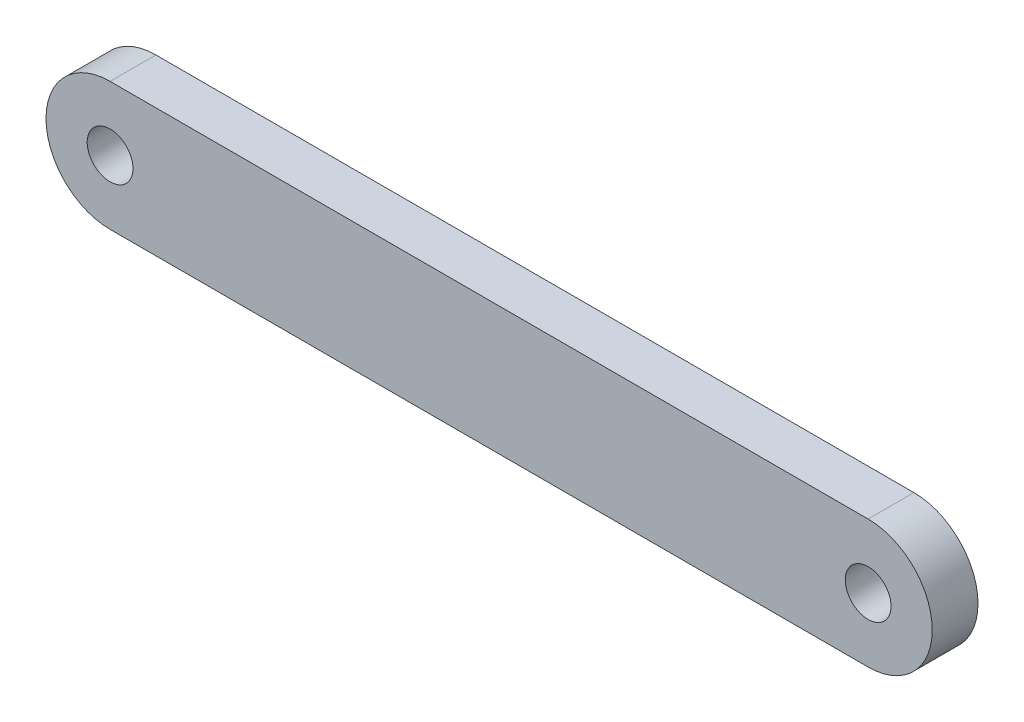
ISO-10303-21;
HEADER;
FILE_DESCRIPTION(('STEP AP214'),'2;1');
FILE_NAME('part.step','',(''),(''),'','','');
FILE_SCHEMA(('AUTOMOTIVE_DESIGN { 1 0 10303 214 1 1 1 1 }'));
ENDSEC;
DATA;
#1=APPLICATION_CONTEXT('core data for automotive mechanical design processes');
#2=APPLICATION_PROTOCOL_DEFINITION('international standard','automotive_design',2000,#1);
#3=PRODUCT_CONTEXT('',#1,'mechanical');
#4=PRODUCT('Part','Part','',(#3));
#5=PRODUCT_RELATED_PRODUCT_CATEGORY('part','',(#4));
#6=PRODUCT_DEFINITION_FORMATION('','',#4);
#7=PRODUCT_DEFINITION_CONTEXT('part definition',#1,'design');
#8=PRODUCT_DEFINITION('design','',#6,#7);
#9=PRODUCT_DEFINITION_SHAPE('','',#8);
#10=(LENGTH_UNIT() NAMED_UNIT(*) SI_UNIT(.MILLI.,.METRE.));
#11=(NAMED_UNIT(*) PLANE_ANGLE_UNIT() SI_UNIT($,.RADIAN.));
#12=(NAMED_UNIT(*) SI_UNIT($,.STERADIAN.) SOLID_ANGLE_UNIT());
#13=UNCERTAINTY_MEASURE_WITH_UNIT(LENGTH_MEASURE(1.E-05),#10,'distance_accuracy_value','');
#14=(GEOMETRIC_REPRESENTATION_CONTEXT(3) GLOBAL_UNCERTAINTY_ASSIGNED_CONTEXT((#13)) GLOBAL_UNIT_ASSIGNED_CONTEXT((#10,
#11,#12)) REPRESENTATION_CONTEXT('',''));
#15=CARTESIAN_POINT('',(0.,0.,0.));
#16=DIRECTION('',(0.,0.,1.));
#17=DIRECTION('',(1.,0.,0.));
#18=AXIS2_PLACEMENT_3D('',#15,#16,#17);
#19=CARTESIAN_POINT('',(55.232,0.116697774587227,6.35));
#20=DIRECTION('',(0.,0.,-1.));
#21=DIRECTION('',(-1.,0.,0.));
#22=AXIS2_PLACEMENT_3D('',#19,#20,#21);
#23=PLANE('',#22);
#24=CARTESIAN_POINT('',(55.232,0.116697774587227,6.35));
#25=DIRECTION('',(0.,0.,1.));
#26=DIRECTION('',(-1.,0.,0.));
#27=AXIS2_PLACEMENT_3D('',#24,#25,#26);
#28=CIRCLE('',#27,8.89);
#29=CARTESIAN_POINT('',(55.232,-8.77330222541277,6.35));
#30=VERTEX_POINT('',#29);
#31=CARTESIAN_POINT('',(55.232,9.00669777458723,6.35));
#32=VERTEX_POINT('',#31);
#33=EDGE_CURVE('E93',#30,#32,#28,.T.);
#34=ORIENTED_EDGE('',*,*,#33,.T.);
#35=DIRECTION('',(-1.,0.,0.));
#36=VECTOR('',#35,1.);
#37=CARTESIAN_POINT('',(-49.911,9.00669777458723,6.35));
#38=LINE('',#37,#36);
#39=CARTESIAN_POINT('',(-49.911,9.00669777458723,6.35));
#40=VERTEX_POINT('',#39);
#41=EDGE_CURVE('E88',#32,#40,#38,.T.);
#42=ORIENTED_EDGE('',*,*,#41,.T.);
#43=CARTESIAN_POINT('',(-49.911,0.116697774587227,6.35));
#44=DIRECTION('',(0.,0.,1.));
#45=DIRECTION('',(1.,0.,0.));
#46=AXIS2_PLACEMENT_3D('',#43,#44,#45);
#47=CIRCLE('',#46,8.89);
#48=CARTESIAN_POINT('',(-49.911,-8.77330222541277,6.35));
#49=VERTEX_POINT('',#48);
#50=EDGE_CURVE('E90',#40,#49,#47,.T.);
#51=ORIENTED_EDGE('',*,*,#50,.T.);
#52=DIRECTION('',(1.,0.,0.));
#53=VECTOR('',#52,1.);
#54=CARTESIAN_POINT('',(-49.911,-8.77330222541277,6.35));
#55=LINE('',#54,#53);
#56=EDGE_CURVE('E57',#49,#30,#55,.T.);
#57=ORIENTED_EDGE('',*,*,#56,.T.);
#58=EDGE_LOOP('',(#34,#42,#51,#57));
#59=FACE_BOUND('',#58,.T.);
#60=CARTESIAN_POINT('',(-49.911,0.116697774587227,6.35));
#61=DIRECTION('',(0.,0.,1.));
#62=DIRECTION('',(1.,0.,0.));
#63=AXIS2_PLACEMENT_3D('',#60,#61,#62);
#64=CIRCLE('',#63,3.175);
#65=CARTESIAN_POINT('',(-46.736,0.116697774587227,6.35));
#66=VERTEX_POINT('',#65);
#67=EDGE_CURVE('E106',#66,#66,#64,.T.);
#68=ORIENTED_EDGE('',*,*,#67,.F.);
#69=EDGE_LOOP('',(#68));
#70=FACE_BOUND('',#69,.T.);
#71=CARTESIAN_POINT('',(55.232,0.116697774587227,6.35));
#72=DIRECTION('',(0.,0.,1.));
#73=DIRECTION('',(1.,0.,0.));
#74=AXIS2_PLACEMENT_3D('',#71,#72,#73);
#75=CIRCLE('',#74,3.175);
#76=CARTESIAN_POINT('',(58.407,0.116697774587227,6.35));
#77=VERTEX_POINT('',#76);
#78=EDGE_CURVE('E123',#77,#77,#75,.T.);
#79=ORIENTED_EDGE('',*,*,#78,.F.);
#80=EDGE_LOOP('',(#79));
#81=FACE_BOUND('',#80,.T.);
#82=ADVANCED_FACE('F39',(#59,#70,#81),#23,.F.);
#83=CARTESIAN_POINT('',(55.232,0.116697774587227,0.));
#84=DIRECTION('',(0.,0.,-1.));
#85=DIRECTION('',(-1.,0.,0.));
#86=AXIS2_PLACEMENT_3D('',#83,#84,#85);
#87=PLANE('',#86);
#88=CARTESIAN_POINT('',(-49.911,0.116697774587227,0.));
#89=DIRECTION('',(0.,0.,1.));
#90=DIRECTION('',(1.,0.,0.));
#91=AXIS2_PLACEMENT_3D('',#88,#89,#90);
#92=CIRCLE('',#91,3.175);
#93=CARTESIAN_POINT('',(-46.736,0.116697774587227,0.));
#94=VERTEX_POINT('',#93);
#95=EDGE_CURVE('E120',#94,#94,#92,.T.);
#96=ORIENTED_EDGE('',*,*,#95,.T.);
#97=EDGE_LOOP('',(#96));
#98=FACE_BOUND('',#97,.T.);
#99=CARTESIAN_POINT('',(55.232,0.116697774587227,0.));
#100=DIRECTION('',(0.,0.,1.));
#101=DIRECTION('',(-1.,0.,0.));
#102=AXIS2_PLACEMENT_3D('',#99,#100,#101);
#103=CIRCLE('',#102,8.89);
#104=CARTESIAN_POINT('',(55.232,-8.77330222541277,0.));
#105=VERTEX_POINT('',#104);
#106=CARTESIAN_POINT('',(55.232,9.00669777458723,0.));
#107=VERTEX_POINT('',#106);
#108=EDGE_CURVE('E103',#105,#107,#103,.T.);
#109=ORIENTED_EDGE('',*,*,#108,.F.);
#110=DIRECTION('',(1.,0.,0.));
#111=VECTOR('',#110,1.);
#112=CARTESIAN_POINT('',(-49.911,-8.77330222541277,0.));
#113=LINE('',#112,#111);
#114=CARTESIAN_POINT('',(-49.911,-8.77330222541277,0.));
#115=VERTEX_POINT('',#114);
#116=EDGE_CURVE('E78',#115,#105,#113,.T.);
#117=ORIENTED_EDGE('',*,*,#116,.F.);
#118=CARTESIAN_POINT('',(-49.911,0.116697774587227,0.));
#119=DIRECTION('',(0.,0.,1.));
#120=DIRECTION('',(1.,0.,0.));
#121=AXIS2_PLACEMENT_3D('',#118,#119,#120);
#122=CIRCLE('',#121,8.89);
#123=CARTESIAN_POINT('',(-49.911,9.00669777458723,0.));
#124=VERTEX_POINT('',#123);
#125=EDGE_CURVE('E71',#124,#115,#122,.T.);
#126=ORIENTED_EDGE('',*,*,#125,.F.);
#127=DIRECTION('',(-1.,0.,0.));
#128=VECTOR('',#127,1.);
#129=CARTESIAN_POINT('',(-49.911,9.00669777458723,0.));
#130=LINE('',#129,#128);
#131=EDGE_CURVE('E92',#107,#124,#130,.T.);
#132=ORIENTED_EDGE('',*,*,#131,.F.);
#133=EDGE_LOOP('',(#109,#117,#126,#132));
#134=FACE_BOUND('',#133,.T.);
#135=CARTESIAN_POINT('',(55.232,0.116697774587227,0.));
#136=DIRECTION('',(0.,0.,1.));
#137=DIRECTION('',(1.,0.,0.));
#138=AXIS2_PLACEMENT_3D('',#135,#136,#137);
#139=CIRCLE('',#138,3.175);
#140=CARTESIAN_POINT('',(58.407,0.116697774587227,0.));
#141=VERTEX_POINT('',#140);
#142=EDGE_CURVE('E124',#141,#141,#139,.T.);
#143=ORIENTED_EDGE('',*,*,#142,.T.);
#144=EDGE_LOOP('',(#143));
#145=FACE_BOUND('',#144,.T.);
#146=ADVANCED_FACE('F111',(#98,#134,#145),#87,.T.);
#147=CARTESIAN_POINT('',(55.232,0.116697774587227,6.35));
#148=DIRECTION('',(0.,0.,-1.));
#149=DIRECTION('',(-1.,0.,0.));
#150=AXIS2_PLACEMENT_3D('',#147,#148,#149);
#151=CYLINDRICAL_SURFACE('',#150,8.89);
#152=ORIENTED_EDGE('',*,*,#108,.T.);
#153=DIRECTION('',(0.,0.,-1.));
#154=VECTOR('',#153,1.);
#155=CARTESIAN_POINT('',(55.232,9.00669777458723,6.35));
#156=LINE('',#155,#154);
#157=EDGE_CURVE('E11',#32,#107,#156,.T.);
#158=ORIENTED_EDGE('',*,*,#157,.F.);
#159=ORIENTED_EDGE('',*,*,#33,.F.);
#160=DIRECTION('',(0.,0.,-1.));
#161=VECTOR('',#160,1.);
#162=CARTESIAN_POINT('',(55.232,-8.77330222541277,6.35));
#163=LINE('',#162,#161);
#164=EDGE_CURVE('E97',#30,#105,#163,.T.);
#165=ORIENTED_EDGE('',*,*,#164,.T.);
#166=EDGE_LOOP('',(#152,#158,#159,#165));
#167=FACE_BOUND('',#166,.T.);
#168=ADVANCED_FACE('F41',(#167),#151,.T.);
#169=CARTESIAN_POINT('',(-49.911,9.00669777458723,6.35));
#170=DIRECTION('',(0.,-1.,0.));
#171=DIRECTION('',(0.,0.,-1.));
#172=AXIS2_PLACEMENT_3D('',#169,#170,#171);
#173=PLANE('',#172);
#174=ORIENTED_EDGE('',*,*,#131,.T.);
#175=DIRECTION('',(0.,0.,-1.));
#176=VECTOR('',#175,1.);
#177=CARTESIAN_POINT('',(-49.911,9.00669777458723,6.35));
#178=LINE('',#177,#176);
#179=EDGE_CURVE('E48',#40,#124,#178,.T.);
#180=ORIENTED_EDGE('',*,*,#179,.F.);
#181=ORIENTED_EDGE('',*,*,#41,.F.);
#182=ORIENTED_EDGE('',*,*,#157,.T.);
#183=EDGE_LOOP('',(#174,#180,#181,#182));
#184=FACE_BOUND('',#183,.T.);
#185=ADVANCED_FACE('F94',(#184),#173,.F.);
#186=CARTESIAN_POINT('',(-49.911,0.116697774587227,6.35));
#187=DIRECTION('',(0.,0.,-1.));
#188=DIRECTION('',(-1.,0.,0.));
#189=AXIS2_PLACEMENT_3D('',#186,#187,#188);
#190=CYLINDRICAL_SURFACE('',#189,8.89);
#191=ORIENTED_EDGE('',*,*,#125,.T.);
#192=DIRECTION('',(0.,0.,-1.));
#193=VECTOR('',#192,1.);
#194=CARTESIAN_POINT('',(-49.911,-8.77330222541277,6.35));
#195=LINE('',#194,#193);
#196=EDGE_CURVE('E96',#49,#115,#195,.T.);
#197=ORIENTED_EDGE('',*,*,#196,.F.);
#198=ORIENTED_EDGE('',*,*,#50,.F.);
#199=ORIENTED_EDGE('',*,*,#179,.T.);
#200=EDGE_LOOP('',(#191,#197,#198,#199));
#201=FACE_BOUND('',#200,.T.);
#202=ADVANCED_FACE('F100',(#201),#190,.T.);
#203=CARTESIAN_POINT('',(-49.911,-8.77330222541277,6.35));
#204=DIRECTION('',(0.,1.,0.));
#205=DIRECTION('',(0.,0.,1.));
#206=AXIS2_PLACEMENT_3D('',#203,#204,#205);
#207=PLANE('',#206);
#208=ORIENTED_EDGE('',*,*,#116,.T.);
#209=ORIENTED_EDGE('',*,*,#164,.F.);
#210=ORIENTED_EDGE('',*,*,#56,.F.);
#211=ORIENTED_EDGE('',*,*,#196,.T.);
#212=EDGE_LOOP('',(#208,#209,#210,#211));
#213=FACE_BOUND('',#212,.T.);
#214=ADVANCED_FACE('F112',(#213),#207,.F.);
#215=CARTESIAN_POINT('',(-49.911,0.116697774587227,6.35));
#216=DIRECTION('',(0.,0.,-1.));
#217=DIRECTION('',(-1.,0.,0.));
#218=AXIS2_PLACEMENT_3D('',#215,#216,#217);
#219=CYLINDRICAL_SURFACE('',#218,3.175);
#220=ORIENTED_EDGE('',*,*,#67,.T.);
#221=EDGE_LOOP('',(#220));
#222=FACE_BOUND('',#221,.T.);
#223=ORIENTED_EDGE('',*,*,#95,.F.);
#224=EDGE_LOOP('',(#223));
#225=FACE_BOUND('',#224,.T.);
#226=ADVANCED_FACE('F143',(#222,#225),#219,.F.);
#227=CARTESIAN_POINT('',(55.232,0.116697774587227,6.35));
#228=DIRECTION('',(0.,0.,-1.));
#229=DIRECTION('',(-1.,0.,0.));
#230=AXIS2_PLACEMENT_3D('',#227,#228,#229);
#231=CYLINDRICAL_SURFACE('',#230,3.175);
#232=ORIENTED_EDGE('',*,*,#78,.T.);
#233=EDGE_LOOP('',(#232));
#234=FACE_BOUND('',#233,.T.);
#235=ORIENTED_EDGE('',*,*,#142,.F.);
#236=EDGE_LOOP('',(#235));
#237=FACE_BOUND('',#236,.T.);
#238=ADVANCED_FACE('F128',(#234,#237),#231,.F.);
#239=CLOSED_SHELL('',(#82,#146,#168,#185,#202,#214,#226,#238));
#240=MANIFOLD_SOLID_BREP('B2',#239);
#241=ADVANCED_BREP_SHAPE_REPRESENTATION('',(#18,#240),#14);
#242=SHAPE_DEFINITION_REPRESENTATION(#9,#241);
ENDSEC;
END-ISO-10303-21;
